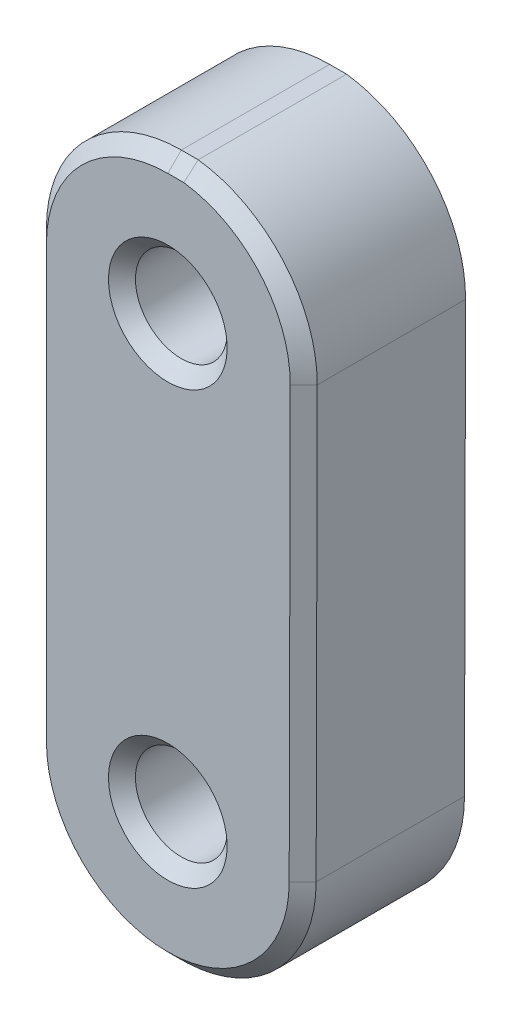
ISO-10303-21;
HEADER;
FILE_DESCRIPTION(('STEP AP214'),'2;1');
FILE_NAME('part.step','',(''),(''),'','','');
FILE_SCHEMA(('AUTOMOTIVE_DESIGN { 1 0 10303 214 1 1 1 1 }'));
ENDSEC;
DATA;
#1=APPLICATION_CONTEXT('core data for automotive mechanical design processes');
#2=APPLICATION_PROTOCOL_DEFINITION('international standard','automotive_design',2000,#1);
#3=PRODUCT_CONTEXT('',#1,'mechanical');
#4=PRODUCT('Part','Part','',(#3));
#5=PRODUCT_RELATED_PRODUCT_CATEGORY('part','',(#4));
#6=PRODUCT_DEFINITION_FORMATION('','',#4);
#7=PRODUCT_DEFINITION_CONTEXT('part definition',#1,'design');
#8=PRODUCT_DEFINITION('design','',#6,#7);
#9=PRODUCT_DEFINITION_SHAPE('','',#8);
#10=(LENGTH_UNIT() NAMED_UNIT(*) SI_UNIT(.MILLI.,.METRE.));
#11=(NAMED_UNIT(*) PLANE_ANGLE_UNIT() SI_UNIT($,.RADIAN.));
#12=(NAMED_UNIT(*) SI_UNIT($,.STERADIAN.) SOLID_ANGLE_UNIT());
#13=UNCERTAINTY_MEASURE_WITH_UNIT(LENGTH_MEASURE(1.E-05),#10,'distance_accuracy_value','');
#14=(GEOMETRIC_REPRESENTATION_CONTEXT(3) GLOBAL_UNCERTAINTY_ASSIGNED_CONTEXT((#13)) GLOBAL_UNIT_ASSIGNED_CONTEXT((#10,
#11,#12)) REPRESENTATION_CONTEXT('',''));
#15=CARTESIAN_POINT('',(0.,0.,0.));
#16=DIRECTION('',(0.,0.,1.));
#17=DIRECTION('',(1.,0.,0.));
#18=AXIS2_PLACEMENT_3D('',#15,#16,#17);
#19=CARTESIAN_POINT('',(-19.,-8.,6.));
#20=DIRECTION('',(0.,0.,-1.));
#21=DIRECTION('',(-1.,0.,0.));
#22=AXIS2_PLACEMENT_3D('',#19,#20,#21);
#23=CYLINDRICAL_SURFACE('',#22,1.70000000000001);
#24=CARTESIAN_POINT('',(-19.,-8.,5.49999999999999));
#25=DIRECTION('',(0.,0.,-1.));
#26=DIRECTION('',(-1.,0.,0.));
#27=AXIS2_PLACEMENT_3D('',#24,#25,#26);
#28=CIRCLE('',#27,1.70000000000001);
#29=CARTESIAN_POINT('',(-20.7,-8.,5.49999999999999));
#30=VERTEX_POINT('',#29);
#31=EDGE_CURVE('E11',#30,#30,#28,.F.);
#32=ORIENTED_EDGE('',*,*,#31,.T.);
#33=EDGE_LOOP('',(#32));
#34=FACE_BOUND('',#33,.T.);
#35=CARTESIAN_POINT('',(-19.,-8.,2.4));
#36=DIRECTION('',(0.,0.,-1.));
#37=DIRECTION('',(-1.,0.,0.));
#38=AXIS2_PLACEMENT_3D('',#35,#36,#37);
#39=CIRCLE('',#38,1.70000000000001);
#40=CARTESIAN_POINT('',(-20.7,-8.,2.4));
#41=VERTEX_POINT('',#40);
#42=EDGE_CURVE('E234',#41,#41,#39,.T.);
#43=ORIENTED_EDGE('',*,*,#42,.T.);
#44=EDGE_LOOP('',(#43));
#45=FACE_BOUND('',#44,.T.);
#46=ADVANCED_FACE('F36',(#34,#45),#23,.F.);
#47=CARTESIAN_POINT('',(-19.,8.,6.));
#48=DIRECTION('',(0.,0.,-1.));
#49=DIRECTION('',(-1.,0.,0.));
#50=AXIS2_PLACEMENT_3D('',#47,#48,#49);
#51=CYLINDRICAL_SURFACE('',#50,1.70000000000001);
#52=CARTESIAN_POINT('',(-19.,8.,5.49999999999999));
#53=DIRECTION('',(0.,0.,-1.));
#54=DIRECTION('',(-1.,0.,0.));
#55=AXIS2_PLACEMENT_3D('',#52,#53,#54);
#56=CIRCLE('',#55,1.70000000000001);
#57=CARTESIAN_POINT('',(-20.7,8.,5.49999999999999));
#58=VERTEX_POINT('',#57);
#59=EDGE_CURVE('E45',#58,#58,#56,.F.);
#60=ORIENTED_EDGE('',*,*,#59,.T.);
#61=EDGE_LOOP('',(#60));
#62=FACE_BOUND('',#61,.T.);
#63=CARTESIAN_POINT('',(-19.,8.,2.4));
#64=DIRECTION('',(0.,0.,-1.));
#65=DIRECTION('',(-1.,0.,0.));
#66=AXIS2_PLACEMENT_3D('',#63,#64,#65);
#67=CIRCLE('',#66,1.70000000000001);
#68=CARTESIAN_POINT('',(-20.7,8.,2.4));
#69=VERTEX_POINT('',#68);
#70=EDGE_CURVE('E280',#69,#69,#67,.T.);
#71=ORIENTED_EDGE('',*,*,#70,.T.);
#72=EDGE_LOOP('',(#71));
#73=FACE_BOUND('',#72,.T.);
#74=ADVANCED_FACE('F400',(#62,#73),#51,.F.);
#75=CARTESIAN_POINT('',(19.,-8.,6.));
#76=DIRECTION('',(0.,0.,-1.));
#77=DIRECTION('',(-1.,0.,0.));
#78=AXIS2_PLACEMENT_3D('',#75,#76,#77);
#79=PLANE('',#78);
#80=CARTESIAN_POINT('',(-19.,8.,6.));
#81=DIRECTION('',(0.,0.,-1.));
#82=DIRECTION('',(-1.,0.,0.));
#83=AXIS2_PLACEMENT_3D('',#80,#81,#82);
#84=CIRCLE('',#83,4.53913779806721);
#85=CARTESIAN_POINT('',(-14.4609180170143,7.97779365421222,6.));
#86=VERTEX_POINT('',#85);
#87=CARTESIAN_POINT('',(-18.4052126852036,12.5,6.));
#88=VERTEX_POINT('',#87);
#89=EDGE_CURVE('E338',#86,#88,#84,.F.);
#90=ORIENTED_EDGE('',*,*,#89,.T.);
#91=DIRECTION('',(-1.,0.,0.));
#92=VECTOR('',#91,1.);
#93=CARTESIAN_POINT('',(19.,12.5,6.));
#94=LINE('',#93,#92);
#95=CARTESIAN_POINT('',(-19.,12.5,6.));
#96=VERTEX_POINT('',#95);
#97=EDGE_CURVE('E340',#88,#96,#94,.T.);
#98=ORIENTED_EDGE('',*,*,#97,.T.);
#99=CARTESIAN_POINT('',(-19.,8.,6.));
#100=DIRECTION('',(0.,0.,-1.));
#101=DIRECTION('',(-1.,0.,0.));
#102=AXIS2_PLACEMENT_3D('',#99,#100,#101);
#103=CIRCLE('',#102,4.5);
#104=CARTESIAN_POINT('',(-23.5,8.,6.));
#105=VERTEX_POINT('',#104);
#106=EDGE_CURVE('E336',#96,#105,#103,.F.);
#107=ORIENTED_EDGE('',*,*,#106,.T.);
#108=DIRECTION('',(0.,-1.,0.));
#109=VECTOR('',#108,1.);
#110=CARTESIAN_POINT('',(-23.5,-8.,6.));
#111=LINE('',#110,#109);
#112=CARTESIAN_POINT('',(-23.5,-8.,6.));
#113=VERTEX_POINT('',#112);
#114=EDGE_CURVE('E334',#105,#113,#111,.T.);
#115=ORIENTED_EDGE('',*,*,#114,.T.);
#116=CARTESIAN_POINT('',(-19.,-8.,6.));
#117=DIRECTION('',(0.,0.,-1.));
#118=DIRECTION('',(-1.,0.,0.));
#119=AXIS2_PLACEMENT_3D('',#116,#117,#118);
#120=CIRCLE('',#119,4.5);
#121=CARTESIAN_POINT('',(-14.5000014958553,-7.99999999604275,6.));
#122=VERTEX_POINT('',#121);
#123=EDGE_CURVE('E332',#113,#122,#120,.F.);
#124=ORIENTED_EDGE('',*,*,#123,.T.);
#125=DIRECTION('',(0.00244610506116911,0.99999700828054,0.));
#126=VECTOR('',#125,1.);
#127=CARTESIAN_POINT('',(-14.499801050952,-7.91805572194682,6.));
#128=LINE('',#127,#126);
#129=EDGE_CURVE('E330',#122,#86,#128,.T.);
#130=ORIENTED_EDGE('',*,*,#129,.T.);
#131=EDGE_LOOP('',(#90,#98,#107,#115,#124,#130));
#132=FACE_BOUND('',#131,.T.);
#133=CARTESIAN_POINT('',(-19.,8.,6.));
#134=DIRECTION('',(0.,0.,-1.));
#135=DIRECTION('',(-1.,0.,0.));
#136=AXIS2_PLACEMENT_3D('',#133,#134,#135);
#137=CIRCLE('',#136,2.20000000000003);
#138=CARTESIAN_POINT('',(-21.2,8.,6.));
#139=VERTEX_POINT('',#138);
#140=EDGE_CURVE('E327',#139,#139,#137,.T.);
#141=ORIENTED_EDGE('',*,*,#140,.T.);
#142=EDGE_LOOP('',(#141));
#143=FACE_BOUND('',#142,.T.);
#144=CARTESIAN_POINT('',(-19.,-8.,6.));
#145=DIRECTION('',(0.,0.,-1.));
#146=DIRECTION('',(-1.,0.,0.));
#147=AXIS2_PLACEMENT_3D('',#144,#145,#146);
#148=CIRCLE('',#147,2.20000000000003);
#149=CARTESIAN_POINT('',(-21.2,-8.,6.));
#150=VERTEX_POINT('',#149);
#151=EDGE_CURVE('E320',#150,#150,#148,.T.);
#152=ORIENTED_EDGE('',*,*,#151,.T.);
#153=EDGE_LOOP('',(#152));
#154=FACE_BOUND('',#153,.T.);
#155=ADVANCED_FACE('F406',(#132,#143,#154),#79,.F.);
#156=CARTESIAN_POINT('',(19.,-8.,0.));
#157=DIRECTION('',(0.,0.,-1.));
#158=DIRECTION('',(-1.,0.,0.));
#159=AXIS2_PLACEMENT_3D('',#156,#157,#158);
#160=PLANE('',#159);
#161=DIRECTION('',(-1.,0.,0.));
#162=VECTOR('',#161,1.);
#163=CARTESIAN_POINT('',(-17.4,-10.7712812921102,0.));
#164=LINE('',#163,#162);
#165=CARTESIAN_POINT('',(-17.4,-10.7712812921102,0.));
#166=VERTEX_POINT('',#165);
#167=CARTESIAN_POINT('',(-20.6,-10.7712812921102,0.));
#168=VERTEX_POINT('',#167);
#169=EDGE_CURVE('E190',#166,#168,#164,.T.);
#170=ORIENTED_EDGE('',*,*,#169,.F.);
#171=DIRECTION('',(-0.500000000000001,-0.866025403784438,0.));
#172=VECTOR('',#171,1.);
#173=CARTESIAN_POINT('',(-15.8,-8.,0.));
#174=LINE('',#173,#172);
#175=CARTESIAN_POINT('',(-15.8,-8.,0.));
#176=VERTEX_POINT('',#175);
#177=EDGE_CURVE('E208',#176,#166,#174,.T.);
#178=ORIENTED_EDGE('',*,*,#177,.F.);
#179=DIRECTION('',(0.499999999999999,-0.866025403784439,0.));
#180=VECTOR('',#179,1.);
#181=CARTESIAN_POINT('',(-17.4,-5.2287187078898,0.));
#182=LINE('',#181,#180);
#183=CARTESIAN_POINT('',(-17.4,-5.2287187078898,0.));
#184=VERTEX_POINT('',#183);
#185=EDGE_CURVE('E211',#184,#176,#182,.T.);
#186=ORIENTED_EDGE('',*,*,#185,.F.);
#187=DIRECTION('',(1.,0.,0.));
#188=VECTOR('',#187,1.);
#189=CARTESIAN_POINT('',(-20.6,-5.2287187078898,0.));
#190=LINE('',#189,#188);
#191=CARTESIAN_POINT('',(-20.6,-5.2287187078898,0.));
#192=VERTEX_POINT('',#191);
#193=EDGE_CURVE('E227',#192,#184,#190,.T.);
#194=ORIENTED_EDGE('',*,*,#193,.F.);
#195=DIRECTION('',(0.5,0.866025403784439,0.));
#196=VECTOR('',#195,1.);
#197=CARTESIAN_POINT('',(-22.2,-8.,0.));
#198=LINE('',#197,#196);
#199=CARTESIAN_POINT('',(-22.2,-8.,0.));
#200=VERTEX_POINT('',#199);
#201=EDGE_CURVE('E224',#200,#192,#198,.T.);
#202=ORIENTED_EDGE('',*,*,#201,.F.);
#203=DIRECTION('',(-0.499999999999999,0.866025403784439,0.));
#204=VECTOR('',#203,1.);
#205=CARTESIAN_POINT('',(-20.6,-10.7712812921102,0.));
#206=LINE('',#205,#204);
#207=EDGE_CURVE('E222',#168,#200,#206,.T.);
#208=ORIENTED_EDGE('',*,*,#207,.F.);
#209=EDGE_LOOP('',(#170,#178,#186,#194,#202,#208));
#210=FACE_BOUND('',#209,.T.);
#211=DIRECTION('',(-1.,0.,0.));
#212=VECTOR('',#211,1.);
#213=CARTESIAN_POINT('',(-17.4,5.22871870788979,0.));
#214=LINE('',#213,#212);
#215=CARTESIAN_POINT('',(-17.4,5.22871870788979,0.));
#216=VERTEX_POINT('',#215);
#217=CARTESIAN_POINT('',(-20.6,5.22871870788979,0.));
#218=VERTEX_POINT('',#217);
#219=EDGE_CURVE('E262',#216,#218,#214,.T.);
#220=ORIENTED_EDGE('',*,*,#219,.F.);
#221=DIRECTION('',(-0.5,-0.866025403784438,0.));
#222=VECTOR('',#221,1.);
#223=CARTESIAN_POINT('',(-15.8,8.,0.));
#224=LINE('',#223,#222);
#225=CARTESIAN_POINT('',(-15.8,8.,0.));
#226=VERTEX_POINT('',#225);
#227=EDGE_CURVE('E246',#226,#216,#224,.T.);
#228=ORIENTED_EDGE('',*,*,#227,.F.);
#229=DIRECTION('',(0.500000000000001,-0.866025403784438,0.));
#230=VECTOR('',#229,1.);
#231=CARTESIAN_POINT('',(-17.4,10.7712812921102,0.));
#232=LINE('',#231,#230);
#233=CARTESIAN_POINT('',(-17.4,10.7712812921102,0.));
#234=VERTEX_POINT('',#233);
#235=EDGE_CURVE('E273',#234,#226,#232,.T.);
#236=ORIENTED_EDGE('',*,*,#235,.F.);
#237=DIRECTION('',(1.,0.,0.));
#238=VECTOR('',#237,1.);
#239=CARTESIAN_POINT('',(-20.6,10.7712812921102,0.));
#240=LINE('',#239,#238);
#241=CARTESIAN_POINT('',(-20.6,10.7712812921102,0.));
#242=VERTEX_POINT('',#241);
#243=EDGE_CURVE('E270',#242,#234,#240,.T.);
#244=ORIENTED_EDGE('',*,*,#243,.F.);
#245=DIRECTION('',(0.5,0.866025403784438,0.));
#246=VECTOR('',#245,1.);
#247=CARTESIAN_POINT('',(-22.2,7.99999999999999,0.));
#248=LINE('',#247,#246);
#249=CARTESIAN_POINT('',(-22.2,7.99999999999999,0.));
#250=VERTEX_POINT('',#249);
#251=EDGE_CURVE('E267',#250,#242,#248,.T.);
#252=ORIENTED_EDGE('',*,*,#251,.F.);
#253=DIRECTION('',(-0.5,0.866025403784439,0.));
#254=VECTOR('',#253,1.);
#255=CARTESIAN_POINT('',(-20.6,5.22871870788979,0.));
#256=LINE('',#255,#254);
#257=EDGE_CURVE('E264',#218,#250,#256,.T.);
#258=ORIENTED_EDGE('',*,*,#257,.F.);
#259=EDGE_LOOP('',(#220,#228,#236,#244,#252,#258));
#260=FACE_BOUND('',#259,.T.);
#261=DIRECTION('',(-0.00244610506116911,-0.99999700828054,0.));
#262=VECTOR('',#261,1.);
#263=CARTESIAN_POINT('',(-13.9803474500364,0.0341975009637657,0.));
#264=LINE('',#263,#262);
#265=CARTESIAN_POINT('',(-13.960922504589,7.97534755281011,0.));
#266=VERTEX_POINT('',#265);
#267=CARTESIAN_POINT('',(-14.,-7.99999999966864,0.));
#268=VERTEX_POINT('',#267);
#269=EDGE_CURVE('E293',#266,#268,#264,.T.);
#270=ORIENTED_EDGE('',*,*,#269,.T.);
#271=CARTESIAN_POINT('',(-19.,-8.,0.));
#272=DIRECTION('',(0.,0.,1.));
#273=DIRECTION('',(-1.,0.,0.));
#274=AXIS2_PLACEMENT_3D('',#271,#272,#273);
#275=CIRCLE('',#274,5.);
#276=CARTESIAN_POINT('',(-24.,-8.,0.));
#277=VERTEX_POINT('',#276);
#278=EDGE_CURVE('E312',#277,#268,#275,.T.);
#279=ORIENTED_EDGE('',*,*,#278,.F.);
#280=DIRECTION('',(0.,-1.,0.));
#281=VECTOR('',#280,1.);
#282=CARTESIAN_POINT('',(-24.,-8.,0.));
#283=LINE('',#282,#281);
#284=CARTESIAN_POINT('',(-24.,8.,0.));
#285=VERTEX_POINT('',#284);
#286=EDGE_CURVE('E309',#285,#277,#283,.T.);
#287=ORIENTED_EDGE('',*,*,#286,.F.);
#288=CARTESIAN_POINT('',(-19.,8.,0.));
#289=DIRECTION('',(0.,0.,1.));
#290=DIRECTION('',(-1.,0.,0.));
#291=AXIS2_PLACEMENT_3D('',#288,#289,#290);
#292=CIRCLE('',#291,5.);
#293=CARTESIAN_POINT('',(-19.,13.,0.));
#294=VERTEX_POINT('',#293);
#295=EDGE_CURVE('E306',#294,#285,#292,.T.);
#296=ORIENTED_EDGE('',*,*,#295,.F.);
#297=DIRECTION('',(-1.,0.,0.));
#298=VECTOR('',#297,1.);
#299=CARTESIAN_POINT('',(-19.,13.,0.));
#300=LINE('',#299,#298);
#301=CARTESIAN_POINT('',(-18.373174866562,13.,0.));
#302=VERTEX_POINT('',#301);
#303=EDGE_CURVE('E299',#302,#294,#300,.T.);
#304=ORIENTED_EDGE('',*,*,#303,.F.);
#305=CARTESIAN_POINT('',(-19.,8.,0.));
#306=DIRECTION('',(0.,0.,1.));
#307=DIRECTION('',(1.,0.,0.));
#308=AXIS2_PLACEMENT_3D('',#305,#306,#307);
#309=CIRCLE('',#308,5.03913779806721);
#310=EDGE_CURVE('E291',#266,#302,#309,.T.);
#311=ORIENTED_EDGE('',*,*,#310,.F.);
#312=EDGE_LOOP('',(#270,#279,#287,#296,#304,#311));
#313=FACE_BOUND('',#312,.T.);
#314=ADVANCED_FACE('F414',(#210,#260,#313),#160,.T.);
#315=CARTESIAN_POINT('',(-19.,13.,6.));
#316=DIRECTION('',(0.,-1.,0.));
#317=DIRECTION('',(0.,0.,-1.));
#318=AXIS2_PLACEMENT_3D('',#315,#316,#317);
#319=PLANE('',#318);
#320=DIRECTION('',(0.,0.,-1.));
#321=VECTOR('',#320,1.);
#322=CARTESIAN_POINT('',(-19.,13.,6.));
#323=LINE('',#322,#321);
#324=CARTESIAN_POINT('',(-19.,13.,5.5));
#325=VERTEX_POINT('',#324);
#326=EDGE_CURVE('E318',#325,#294,#323,.T.);
#327=ORIENTED_EDGE('',*,*,#326,.F.);
#328=DIRECTION('',(1.,0.,0.));
#329=VECTOR('',#328,1.);
#330=CARTESIAN_POINT('',(-19.,13.,5.5));
#331=LINE('',#330,#329);
#332=CARTESIAN_POINT('',(-18.373174866562,13.,5.5));
#333=VERTEX_POINT('',#332);
#334=EDGE_CURVE('E343',#325,#333,#331,.T.);
#335=ORIENTED_EDGE('',*,*,#334,.T.);
#336=DIRECTION('',(0.,0.,1.));
#337=VECTOR('',#336,1.);
#338=CARTESIAN_POINT('',(-18.373174866562,13.,0.));
#339=LINE('',#338,#337);
#340=EDGE_CURVE('E296',#302,#333,#339,.T.);
#341=ORIENTED_EDGE('',*,*,#340,.F.);
#342=ORIENTED_EDGE('',*,*,#303,.T.);
#343=EDGE_LOOP('',(#327,#335,#341,#342));
#344=FACE_BOUND('',#343,.T.);
#345=ADVANCED_FACE('F418',(#344),#319,.F.);
#346=CARTESIAN_POINT('',(-19.,8.,6.));
#347=DIRECTION('',(0.,0.,-1.));
#348=DIRECTION('',(-1.,0.,0.));
#349=AXIS2_PLACEMENT_3D('',#346,#347,#348);
#350=CYLINDRICAL_SURFACE('',#349,5.);
#351=DIRECTION('',(0.,0.,-1.));
#352=VECTOR('',#351,1.);
#353=CARTESIAN_POINT('',(-24.,8.,6.));
#354=LINE('',#353,#352);
#355=CARTESIAN_POINT('',(-24.,8.,5.5));
#356=VERTEX_POINT('',#355);
#357=EDGE_CURVE('E316',#356,#285,#354,.T.);
#358=ORIENTED_EDGE('',*,*,#357,.F.);
#359=CARTESIAN_POINT('',(-19.,8.,5.5));
#360=DIRECTION('',(0.,0.,-1.));
#361=DIRECTION('',(-1.,0.,0.));
#362=AXIS2_PLACEMENT_3D('',#359,#360,#361);
#363=CIRCLE('',#362,5.);
#364=EDGE_CURVE('E348',#356,#325,#363,.T.);
#365=ORIENTED_EDGE('',*,*,#364,.T.);
#366=ORIENTED_EDGE('',*,*,#326,.T.);
#367=ORIENTED_EDGE('',*,*,#295,.T.);
#368=EDGE_LOOP('',(#358,#365,#366,#367));
#369=FACE_BOUND('',#368,.T.);
#370=ADVANCED_FACE('F427',(#369),#350,.T.);
#371=CARTESIAN_POINT('',(-24.,-8.,6.));
#372=DIRECTION('',(1.,0.,0.));
#373=DIRECTION('',(0.,0.,-1.));
#374=AXIS2_PLACEMENT_3D('',#371,#372,#373);
#375=PLANE('',#374);
#376=DIRECTION('',(0.,0.,-1.));
#377=VECTOR('',#376,1.);
#378=CARTESIAN_POINT('',(-24.,-8.,6.));
#379=LINE('',#378,#377);
#380=CARTESIAN_POINT('',(-24.,-8.,5.5));
#381=VERTEX_POINT('',#380);
#382=EDGE_CURVE('E314',#381,#277,#379,.T.);
#383=ORIENTED_EDGE('',*,*,#382,.F.);
#384=DIRECTION('',(0.,1.,0.));
#385=VECTOR('',#384,1.);
#386=CARTESIAN_POINT('',(-24.,-8.,5.5));
#387=LINE('',#386,#385);
#388=EDGE_CURVE('E350',#381,#356,#387,.T.);
#389=ORIENTED_EDGE('',*,*,#388,.T.);
#390=ORIENTED_EDGE('',*,*,#357,.T.);
#391=ORIENTED_EDGE('',*,*,#286,.T.);
#392=EDGE_LOOP('',(#383,#389,#390,#391));
#393=FACE_BOUND('',#392,.T.);
#394=ADVANCED_FACE('F424',(#393),#375,.F.);
#395=CARTESIAN_POINT('',(-19.,-8.,6.));
#396=DIRECTION('',(0.,0.,-1.));
#397=DIRECTION('',(-1.,0.,0.));
#398=AXIS2_PLACEMENT_3D('',#395,#396,#397);
#399=CYLINDRICAL_SURFACE('',#398,5.);
#400=DIRECTION('',(0.,0.,1.));
#401=VECTOR('',#400,1.);
#402=CARTESIAN_POINT('',(-14.,-7.99999999966864,0.));
#403=LINE('',#402,#401);
#404=CARTESIAN_POINT('',(-14.,-7.99999999966864,5.5));
#405=VERTEX_POINT('',#404);
#406=EDGE_CURVE('E297',#268,#405,#403,.T.);
#407=ORIENTED_EDGE('',*,*,#406,.T.);
#408=CARTESIAN_POINT('',(-19.,-8.,5.5));
#409=DIRECTION('',(0.,0.,-1.));
#410=DIRECTION('',(-1.,0.,0.));
#411=AXIS2_PLACEMENT_3D('',#408,#409,#410);
#412=CIRCLE('',#411,5.);
#413=EDGE_CURVE('E60',#405,#381,#412,.T.);
#414=ORIENTED_EDGE('',*,*,#413,.T.);
#415=ORIENTED_EDGE('',*,*,#382,.T.);
#416=ORIENTED_EDGE('',*,*,#278,.T.);
#417=EDGE_LOOP('',(#407,#414,#415,#416));
#418=FACE_BOUND('',#417,.T.);
#419=ADVANCED_FACE('F420',(#418),#399,.T.);
#420=CARTESIAN_POINT('',(-19.,8.,0.));
#421=DIRECTION('',(0.,0.,1.));
#422=DIRECTION('',(1.,0.,0.));
#423=AXIS2_PLACEMENT_3D('',#420,#421,#422);
#424=CYLINDRICAL_SURFACE('',#423,5.03913779806721);
#425=ORIENTED_EDGE('',*,*,#340,.T.);
#426=CARTESIAN_POINT('',(-19.,8.,5.5));
#427=DIRECTION('',(0.,0.,-1.));
#428=DIRECTION('',(-1.,0.,0.));
#429=AXIS2_PLACEMENT_3D('',#426,#427,#428);
#430=CIRCLE('',#429,5.03913779806721);
#431=CARTESIAN_POINT('',(-13.960922504589,7.97534755281011,5.5));
#432=VERTEX_POINT('',#431);
#433=EDGE_CURVE('E346',#333,#432,#430,.T.);
#434=ORIENTED_EDGE('',*,*,#433,.T.);
#435=DIRECTION('',(0.,0.,1.));
#436=VECTOR('',#435,1.);
#437=CARTESIAN_POINT('',(-13.960922504589,7.97534755281011,0.));
#438=LINE('',#437,#436);
#439=EDGE_CURVE('E300',#266,#432,#438,.T.);
#440=ORIENTED_EDGE('',*,*,#439,.F.);
#441=ORIENTED_EDGE('',*,*,#310,.T.);
#442=EDGE_LOOP('',(#425,#434,#440,#441));
#443=FACE_BOUND('',#442,.T.);
#444=ADVANCED_FACE('F423',(#443),#424,.T.);
#445=CARTESIAN_POINT('',(-13.9803474500364,0.0341975009637657,0.));
#446=DIRECTION('',(-0.99999700828054,0.00244610506116911,0.));
#447=DIRECTION('',(-0.00244610506116911,-0.99999700828054,0.));
#448=AXIS2_PLACEMENT_3D('',#445,#446,#447);
#449=PLANE('',#448);
#450=ORIENTED_EDGE('',*,*,#439,.T.);
#451=DIRECTION('',(-0.00244610506116911,-0.99999700828054,0.));
#452=VECTOR('',#451,1.);
#453=CARTESIAN_POINT('',(-13.9803474500364,0.0341975009637657,5.5));
#454=LINE('',#453,#452);
#455=EDGE_CURVE('E53',#432,#405,#454,.T.);
#456=ORIENTED_EDGE('',*,*,#455,.T.);
#457=ORIENTED_EDGE('',*,*,#406,.F.);
#458=ORIENTED_EDGE('',*,*,#269,.F.);
#459=EDGE_LOOP('',(#450,#456,#457,#458));
#460=FACE_BOUND('',#459,.T.);
#461=ADVANCED_FACE('F458',(#460),#449,.F.);
#462=CARTESIAN_POINT('',(-17.4,5.22871870788979,2.4));
#463=DIRECTION('',(0.,-1.,0.));
#464=DIRECTION('',(1.,0.,0.));
#465=AXIS2_PLACEMENT_3D('',#462,#463,#464);
#466=PLANE('',#465);
#467=ORIENTED_EDGE('',*,*,#219,.T.);
#468=DIRECTION('',(0.,0.,-1.));
#469=VECTOR('',#468,1.);
#470=CARTESIAN_POINT('',(-20.6,5.22871870788979,2.4));
#471=LINE('',#470,#469);
#472=CARTESIAN_POINT('',(-20.6,5.22871870788979,2.4));
#473=VERTEX_POINT('',#472);
#474=EDGE_CURVE('E261',#473,#218,#471,.T.);
#475=ORIENTED_EDGE('',*,*,#474,.F.);
#476=DIRECTION('',(-1.,0.,0.));
#477=VECTOR('',#476,1.);
#478=CARTESIAN_POINT('',(-17.4,5.22871870788979,2.4));
#479=LINE('',#478,#477);
#480=CARTESIAN_POINT('',(-17.4,5.22871870788979,2.4));
#481=VERTEX_POINT('',#480);
#482=EDGE_CURVE('E242',#481,#473,#479,.T.);
#483=ORIENTED_EDGE('',*,*,#482,.F.);
#484=DIRECTION('',(0.,0.,-1.));
#485=VECTOR('',#484,1.);
#486=CARTESIAN_POINT('',(-17.4,5.22871870788979,2.4));
#487=LINE('',#486,#485);
#488=EDGE_CURVE('E278',#481,#216,#487,.T.);
#489=ORIENTED_EDGE('',*,*,#488,.T.);
#490=EDGE_LOOP('',(#467,#475,#483,#489));
#491=FACE_BOUND('',#490,.T.);
#492=ADVANCED_FACE('F472',(#491),#466,.F.);
#493=CARTESIAN_POINT('',(-15.8,8.,2.4));
#494=DIRECTION('',(0.866025403784438,-0.5,0.));
#495=DIRECTION('',(0.5,0.866025403784439,0.));
#496=AXIS2_PLACEMENT_3D('',#493,#494,#495);
#497=PLANE('',#496);
#498=ORIENTED_EDGE('',*,*,#227,.T.);
#499=ORIENTED_EDGE('',*,*,#488,.F.);
#500=DIRECTION('',(-0.5,-0.866025403784438,0.));
#501=VECTOR('',#500,1.);
#502=CARTESIAN_POINT('',(-15.8,8.,2.4));
#503=LINE('',#502,#501);
#504=CARTESIAN_POINT('',(-15.8,8.,2.4));
#505=VERTEX_POINT('',#504);
#506=EDGE_CURVE('E258',#505,#481,#503,.T.);
#507=ORIENTED_EDGE('',*,*,#506,.F.);
#508=DIRECTION('',(0.,0.,-1.));
#509=VECTOR('',#508,1.);
#510=CARTESIAN_POINT('',(-15.8,8.,2.4));
#511=LINE('',#510,#509);
#512=EDGE_CURVE('E281',#505,#226,#511,.T.);
#513=ORIENTED_EDGE('',*,*,#512,.T.);
#514=EDGE_LOOP('',(#498,#499,#507,#513));
#515=FACE_BOUND('',#514,.T.);
#516=ADVANCED_FACE('F478',(#515),#497,.F.);
#517=CARTESIAN_POINT('',(-17.4,10.7712812921102,2.4));
#518=DIRECTION('',(0.866025403784438,0.500000000000001,0.));
#519=DIRECTION('',(-0.500000000000001,0.866025403784438,0.));
#520=AXIS2_PLACEMENT_3D('',#517,#518,#519);
#521=PLANE('',#520);
#522=ORIENTED_EDGE('',*,*,#235,.T.);
#523=ORIENTED_EDGE('',*,*,#512,.F.);
#524=DIRECTION('',(0.500000000000001,-0.866025403784438,0.));
#525=VECTOR('',#524,1.);
#526=CARTESIAN_POINT('',(-17.4,10.7712812921102,2.4));
#527=LINE('',#526,#525);
#528=CARTESIAN_POINT('',(-17.4,10.7712812921102,2.4));
#529=VERTEX_POINT('',#528);
#530=EDGE_CURVE('E255',#529,#505,#527,.T.);
#531=ORIENTED_EDGE('',*,*,#530,.F.);
#532=DIRECTION('',(0.,0.,-1.));
#533=VECTOR('',#532,1.);
#534=CARTESIAN_POINT('',(-17.4,10.7712812921102,2.4));
#535=LINE('',#534,#533);
#536=EDGE_CURVE('E283',#529,#234,#535,.T.);
#537=ORIENTED_EDGE('',*,*,#536,.T.);
#538=EDGE_LOOP('',(#522,#523,#531,#537));
#539=FACE_BOUND('',#538,.T.);
#540=ADVANCED_FACE('F494',(#539),#521,.F.);
#541=CARTESIAN_POINT('',(-20.6,10.7712812921102,2.4));
#542=DIRECTION('',(0.,1.,0.));
#543=DIRECTION('',(0.,0.,1.));
#544=AXIS2_PLACEMENT_3D('',#541,#542,#543);
#545=PLANE('',#544);
#546=ORIENTED_EDGE('',*,*,#243,.T.);
#547=ORIENTED_EDGE('',*,*,#536,.F.);
#548=DIRECTION('',(1.,0.,0.));
#549=VECTOR('',#548,1.);
#550=CARTESIAN_POINT('',(-20.6,10.7712812921102,2.4));
#551=LINE('',#550,#549);
#552=CARTESIAN_POINT('',(-20.6,10.7712812921102,2.4));
#553=VERTEX_POINT('',#552);
#554=EDGE_CURVE('E252',#553,#529,#551,.T.);
#555=ORIENTED_EDGE('',*,*,#554,.F.);
#556=DIRECTION('',(0.,0.,-1.));
#557=VECTOR('',#556,1.);
#558=CARTESIAN_POINT('',(-20.6,10.7712812921102,2.4));
#559=LINE('',#558,#557);
#560=EDGE_CURVE('E285',#553,#242,#559,.T.);
#561=ORIENTED_EDGE('',*,*,#560,.T.);
#562=EDGE_LOOP('',(#546,#547,#555,#561));
#563=FACE_BOUND('',#562,.T.);
#564=ADVANCED_FACE('F490',(#563),#545,.F.);
#565=CARTESIAN_POINT('',(-22.2,7.99999999999999,2.4));
#566=DIRECTION('',(-0.866025403784438,0.5,0.));
#567=DIRECTION('',(-0.5,-0.866025403784439,0.));
#568=AXIS2_PLACEMENT_3D('',#565,#566,#567);
#569=PLANE('',#568);
#570=ORIENTED_EDGE('',*,*,#251,.T.);
#571=ORIENTED_EDGE('',*,*,#560,.F.);
#572=DIRECTION('',(0.5,0.866025403784438,0.));
#573=VECTOR('',#572,1.);
#574=CARTESIAN_POINT('',(-22.2,7.99999999999999,2.4));
#575=LINE('',#574,#573);
#576=CARTESIAN_POINT('',(-22.2,7.99999999999999,2.4));
#577=VERTEX_POINT('',#576);
#578=EDGE_CURVE('E249',#577,#553,#575,.T.);
#579=ORIENTED_EDGE('',*,*,#578,.F.);
#580=DIRECTION('',(0.,0.,-1.));
#581=VECTOR('',#580,1.);
#582=CARTESIAN_POINT('',(-22.2,7.99999999999999,2.4));
#583=LINE('',#582,#581);
#584=EDGE_CURVE('E287',#577,#250,#583,.T.);
#585=ORIENTED_EDGE('',*,*,#584,.T.);
#586=EDGE_LOOP('',(#570,#571,#579,#585));
#587=FACE_BOUND('',#586,.T.);
#588=ADVANCED_FACE('F486',(#587),#569,.F.);
#589=CARTESIAN_POINT('',(-20.6,5.22871870788979,2.4));
#590=DIRECTION('',(-0.866025403784439,-0.5,0.));
#591=DIRECTION('',(0.5,-0.866025403784439,0.));
#592=AXIS2_PLACEMENT_3D('',#589,#590,#591);
#593=PLANE('',#592);
#594=ORIENTED_EDGE('',*,*,#257,.T.);
#595=ORIENTED_EDGE('',*,*,#584,.F.);
#596=DIRECTION('',(-0.5,0.866025403784439,0.));
#597=VECTOR('',#596,1.);
#598=CARTESIAN_POINT('',(-20.6,5.22871870788979,2.4));
#599=LINE('',#598,#597);
#600=EDGE_CURVE('E245',#473,#577,#599,.T.);
#601=ORIENTED_EDGE('',*,*,#600,.F.);
#602=ORIENTED_EDGE('',*,*,#474,.T.);
#603=EDGE_LOOP('',(#594,#595,#601,#602));
#604=FACE_BOUND('',#603,.T.);
#605=ADVANCED_FACE('F482',(#604),#593,.F.);
#606=CARTESIAN_POINT('',(0.,0.,2.4));
#607=DIRECTION('',(0.,0.,-1.));
#608=DIRECTION('',(-1.,0.,0.));
#609=AXIS2_PLACEMENT_3D('',#606,#607,#608);
#610=PLANE('',#609);
#611=ORIENTED_EDGE('',*,*,#70,.F.);
#612=EDGE_LOOP('',(#611));
#613=FACE_BOUND('',#612,.T.);
#614=ORIENTED_EDGE('',*,*,#482,.T.);
#615=ORIENTED_EDGE('',*,*,#600,.T.);
#616=ORIENTED_EDGE('',*,*,#578,.T.);
#617=ORIENTED_EDGE('',*,*,#554,.T.);
#618=ORIENTED_EDGE('',*,*,#530,.T.);
#619=ORIENTED_EDGE('',*,*,#506,.T.);
#620=EDGE_LOOP('',(#614,#615,#616,#617,#618,#619));
#621=FACE_BOUND('',#620,.T.);
#622=ADVANCED_FACE('F485',(#613,#621),#610,.T.);
#623=CARTESIAN_POINT('',(-17.4,-10.7712812921102,2.4));
#624=DIRECTION('',(0.,-1.,0.));
#625=DIRECTION('',(0.,0.,-1.));
#626=AXIS2_PLACEMENT_3D('',#623,#624,#625);
#627=PLANE('',#626);
#628=ORIENTED_EDGE('',*,*,#169,.T.);
#629=DIRECTION('',(0.,0.,-1.));
#630=VECTOR('',#629,1.);
#631=CARTESIAN_POINT('',(-20.6,-10.7712812921102,2.4));
#632=LINE('',#631,#630);
#633=CARTESIAN_POINT('',(-20.6,-10.7712812921102,2.4));
#634=VERTEX_POINT('',#633);
#635=EDGE_CURVE('E183',#634,#168,#632,.T.);
#636=ORIENTED_EDGE('',*,*,#635,.F.);
#637=DIRECTION('',(-1.,0.,0.));
#638=VECTOR('',#637,1.);
#639=CARTESIAN_POINT('',(-17.4,-10.7712812921102,2.4));
#640=LINE('',#639,#638);
#641=CARTESIAN_POINT('',(-17.4,-10.7712812921102,2.4));
#642=VERTEX_POINT('',#641);
#643=EDGE_CURVE('E187',#642,#634,#640,.T.);
#644=ORIENTED_EDGE('',*,*,#643,.F.);
#645=DIRECTION('',(0.,0.,-1.));
#646=VECTOR('',#645,1.);
#647=CARTESIAN_POINT('',(-17.4,-10.7712812921102,2.4));
#648=LINE('',#647,#646);
#649=EDGE_CURVE('E232',#642,#166,#648,.T.);
#650=ORIENTED_EDGE('',*,*,#649,.T.);
#651=EDGE_LOOP('',(#628,#636,#644,#650));
#652=FACE_BOUND('',#651,.T.);
#653=ADVANCED_FACE('F185',(#652),#627,.F.);
#654=CARTESIAN_POINT('',(-15.8,-8.,2.4));
#655=DIRECTION('',(0.866025403784438,-0.500000000000001,0.));
#656=DIRECTION('',(0.500000000000001,0.866025403784438,0.));
#657=AXIS2_PLACEMENT_3D('',#654,#655,#656);
#658=PLANE('',#657);
#659=ORIENTED_EDGE('',*,*,#177,.T.);
#660=ORIENTED_EDGE('',*,*,#649,.F.);
#661=DIRECTION('',(-0.500000000000001,-0.866025403784438,0.));
#662=VECTOR('',#661,1.);
#663=CARTESIAN_POINT('',(-15.8,-8.,2.4));
#664=LINE('',#663,#662);
#665=CARTESIAN_POINT('',(-15.8,-8.,2.4));
#666=VERTEX_POINT('',#665);
#667=EDGE_CURVE('E195',#666,#642,#664,.T.);
#668=ORIENTED_EDGE('',*,*,#667,.F.);
#669=DIRECTION('',(0.,0.,-1.));
#670=VECTOR('',#669,1.);
#671=CARTESIAN_POINT('',(-15.8,-8.,2.4));
#672=LINE('',#671,#670);
#673=EDGE_CURVE('E235',#666,#176,#672,.T.);
#674=ORIENTED_EDGE('',*,*,#673,.T.);
#675=EDGE_LOOP('',(#659,#660,#668,#674));
#676=FACE_BOUND('',#675,.T.);
#677=ADVANCED_FACE('F507',(#676),#658,.F.);
#678=CARTESIAN_POINT('',(-17.4,-5.2287187078898,2.4));
#679=DIRECTION('',(0.866025403784439,0.5,0.));
#680=DIRECTION('',(-0.5,0.866025403784439,0.));
#681=AXIS2_PLACEMENT_3D('',#678,#679,#680);
#682=PLANE('',#681);
#683=ORIENTED_EDGE('',*,*,#185,.T.);
#684=ORIENTED_EDGE('',*,*,#673,.F.);
#685=DIRECTION('',(0.499999999999999,-0.866025403784439,0.));
#686=VECTOR('',#685,1.);
#687=CARTESIAN_POINT('',(-17.4,-5.2287187078898,2.4));
#688=LINE('',#687,#686);
#689=CARTESIAN_POINT('',(-17.4,-5.2287187078898,2.4));
#690=VERTEX_POINT('',#689);
#691=EDGE_CURVE('E218',#690,#666,#688,.T.);
#692=ORIENTED_EDGE('',*,*,#691,.F.);
#693=DIRECTION('',(0.,0.,-1.));
#694=VECTOR('',#693,1.);
#695=CARTESIAN_POINT('',(-17.4,-5.2287187078898,2.4));
#696=LINE('',#695,#694);
#697=EDGE_CURVE('E237',#690,#184,#696,.T.);
#698=ORIENTED_EDGE('',*,*,#697,.T.);
#699=EDGE_LOOP('',(#683,#684,#692,#698));
#700=FACE_BOUND('',#699,.T.);
#701=ADVANCED_FACE('F517',(#700),#682,.F.);
#702=CARTESIAN_POINT('',(-20.6,-5.2287187078898,2.4));
#703=DIRECTION('',(0.,1.,0.));
#704=DIRECTION('',(-1.,0.,0.));
#705=AXIS2_PLACEMENT_3D('',#702,#703,#704);
#706=PLANE('',#705);
#707=ORIENTED_EDGE('',*,*,#193,.T.);
#708=ORIENTED_EDGE('',*,*,#697,.F.);
#709=DIRECTION('',(1.,0.,0.));
#710=VECTOR('',#709,1.);
#711=CARTESIAN_POINT('',(-20.6,-5.2287187078898,2.4));
#712=LINE('',#711,#710);
#713=CARTESIAN_POINT('',(-20.6,-5.2287187078898,2.4));
#714=VERTEX_POINT('',#713);
#715=EDGE_CURVE('E215',#714,#690,#712,.T.);
#716=ORIENTED_EDGE('',*,*,#715,.F.);
#717=DIRECTION('',(0.,0.,-1.));
#718=VECTOR('',#717,1.);
#719=CARTESIAN_POINT('',(-20.6,-5.2287187078898,2.4));
#720=LINE('',#719,#718);
#721=EDGE_CURVE('E239',#714,#192,#720,.T.);
#722=ORIENTED_EDGE('',*,*,#721,.T.);
#723=EDGE_LOOP('',(#707,#708,#716,#722));
#724=FACE_BOUND('',#723,.T.);
#725=ADVANCED_FACE('F513',(#724),#706,.F.);
#726=CARTESIAN_POINT('',(-22.2,-8.,2.4));
#727=DIRECTION('',(-0.866025403784439,0.5,0.));
#728=DIRECTION('',(-0.5,-0.866025403784439,0.));
#729=AXIS2_PLACEMENT_3D('',#726,#727,#728);
#730=PLANE('',#729);
#731=ORIENTED_EDGE('',*,*,#201,.T.);
#732=ORIENTED_EDGE('',*,*,#721,.F.);
#733=DIRECTION('',(0.5,0.866025403784439,0.));
#734=VECTOR('',#733,1.);
#735=CARTESIAN_POINT('',(-22.2,-8.,2.4));
#736=LINE('',#735,#734);
#737=CARTESIAN_POINT('',(-22.2,-8.,2.4));
#738=VERTEX_POINT('',#737);
#739=EDGE_CURVE('E203',#738,#714,#736,.T.);
#740=ORIENTED_EDGE('',*,*,#739,.F.);
#741=DIRECTION('',(0.,0.,-1.));
#742=VECTOR('',#741,1.);
#743=CARTESIAN_POINT('',(-22.2,-8.,2.4));
#744=LINE('',#743,#742);
#745=EDGE_CURVE('E194',#738,#200,#744,.T.);
#746=ORIENTED_EDGE('',*,*,#745,.T.);
#747=EDGE_LOOP('',(#731,#732,#740,#746));
#748=FACE_BOUND('',#747,.T.);
#749=ADVANCED_FACE('F510',(#748),#730,.F.);
#750=CARTESIAN_POINT('',(-20.6,-10.7712812921102,2.4));
#751=DIRECTION('',(-0.866025403784439,-0.499999999999999,0.));
#752=DIRECTION('',(0.499999999999999,-0.866025403784439,0.));
#753=AXIS2_PLACEMENT_3D('',#750,#751,#752);
#754=PLANE('',#753);
#755=ORIENTED_EDGE('',*,*,#207,.T.);
#756=ORIENTED_EDGE('',*,*,#745,.F.);
#757=DIRECTION('',(-0.499999999999999,0.866025403784439,0.));
#758=VECTOR('',#757,1.);
#759=CARTESIAN_POINT('',(-20.6,-10.7712812921102,2.4));
#760=LINE('',#759,#758);
#761=EDGE_CURVE('E198',#634,#738,#760,.T.);
#762=ORIENTED_EDGE('',*,*,#761,.F.);
#763=ORIENTED_EDGE('',*,*,#635,.T.);
#764=EDGE_LOOP('',(#755,#756,#762,#763));
#765=FACE_BOUND('',#764,.T.);
#766=ADVANCED_FACE('F199',(#765),#754,.F.);
#767=CARTESIAN_POINT('',(0.,0.,2.4));
#768=DIRECTION('',(0.,0.,-1.));
#769=DIRECTION('',(-1.,0.,0.));
#770=AXIS2_PLACEMENT_3D('',#767,#768,#769);
#771=PLANE('',#770);
#772=ORIENTED_EDGE('',*,*,#42,.F.);
#773=EDGE_LOOP('',(#772));
#774=FACE_BOUND('',#773,.T.);
#775=ORIENTED_EDGE('',*,*,#643,.T.);
#776=ORIENTED_EDGE('',*,*,#761,.T.);
#777=ORIENTED_EDGE('',*,*,#739,.T.);
#778=ORIENTED_EDGE('',*,*,#715,.T.);
#779=ORIENTED_EDGE('',*,*,#691,.T.);
#780=ORIENTED_EDGE('',*,*,#667,.T.);
#781=EDGE_LOOP('',(#775,#776,#777,#778,#779,#780));
#782=FACE_BOUND('',#781,.T.);
#783=ADVANCED_FACE('F205',(#774,#782),#771,.T.);
#784=CARTESIAN_POINT('',(-19.,-8.,6.));
#785=DIRECTION('',(0.,0.,-1.));
#786=DIRECTION('',(-1.,0.,0.));
#787=AXIS2_PLACEMENT_3D('',#784,#785,#786);
#788=CONICAL_SURFACE('',#787,4.5,0.785398163397448);
#789=DIRECTION('',(0.707106781186547,0.,0.707106781186547));
#790=VECTOR('',#789,1.);
#791=CARTESIAN_POINT('',(-24.,-8.,5.5));
#792=LINE('',#791,#790);
#793=EDGE_CURVE('E463',#381,#113,#792,.T.);
#794=ORIENTED_EDGE('',*,*,#793,.F.);
#795=ORIENTED_EDGE('',*,*,#413,.F.);
#796=DIRECTION('',(0.707106781186547,4.68599000833106E-11,-0.707106781186547));
#797=VECTOR('',#796,1.);
#798=CARTESIAN_POINT('',(-14.5,-7.99999999970178,6.));
#799=LINE('',#798,#797);
#800=EDGE_CURVE('E40',#122,#405,#799,.T.);
#801=ORIENTED_EDGE('',*,*,#800,.F.);
#802=ORIENTED_EDGE('',*,*,#123,.F.);
#803=EDGE_LOOP('',(#794,#795,#801,#802));
#804=FACE_BOUND('',#803,.T.);
#805=ADVANCED_FACE('F387',(#804),#788,.T.);
#806=CARTESIAN_POINT('',(-13.9803474500364,0.0341975009637657,5.5));
#807=DIRECTION('',(-0.707104665721437,0.00172965747624743,-0.70710678118654));
#808=DIRECTION('',(-0.00244610506116911,-0.99999700828054,0.));
#809=AXIS2_PLACEMENT_3D('',#806,#807,#808);
#810=PLANE('',#809);
#811=ORIENTED_EDGE('',*,*,#800,.T.);
#812=ORIENTED_EDGE('',*,*,#455,.F.);
#813=DIRECTION('',(0.707099377078405,-0.00345930460318643,-0.707105723457952));
#814=VECTOR('',#813,1.);
#815=CARTESIAN_POINT('',(-14.4609180170143,7.97779365421222,6.));
#816=LINE('',#815,#814);
#817=EDGE_CURVE('E455',#86,#432,#816,.T.);
#818=ORIENTED_EDGE('',*,*,#817,.F.);
#819=ORIENTED_EDGE('',*,*,#129,.F.);
#820=EDGE_LOOP('',(#811,#812,#818,#819));
#821=FACE_BOUND('',#820,.T.);
#822=ADVANCED_FACE('F383',(#821),#810,.F.);
#823=CARTESIAN_POINT('',(-23.5,-8.,6.));
#824=DIRECTION('',(0.70710678118655,0.,-0.707106781186545));
#825=DIRECTION('',(0.,-1.,0.));
#826=AXIS2_PLACEMENT_3D('',#823,#824,#825);
#827=PLANE('',#826);
#828=ORIENTED_EDGE('',*,*,#793,.T.);
#829=ORIENTED_EDGE('',*,*,#114,.F.);
#830=DIRECTION('',(0.707106781186545,0.,0.70710678118655));
#831=VECTOR('',#830,1.);
#832=CARTESIAN_POINT('',(-24.,8.,5.5));
#833=LINE('',#832,#831);
#834=EDGE_CURVE('E365',#356,#105,#833,.T.);
#835=ORIENTED_EDGE('',*,*,#834,.F.);
#836=ORIENTED_EDGE('',*,*,#388,.F.);
#837=EDGE_LOOP('',(#828,#829,#835,#836));
#838=FACE_BOUND('',#837,.T.);
#839=ADVANCED_FACE('F380',(#838),#827,.F.);
#840=CARTESIAN_POINT('',(-19.,8.,6.));
#841=DIRECTION('',(0.,0.,-1.));
#842=DIRECTION('',(-1.,0.,0.));
#843=AXIS2_PLACEMENT_3D('',#840,#841,#842);
#844=CONICAL_SURFACE('',#843,4.53913779806721,0.785398163397447);
#845=ORIENTED_EDGE('',*,*,#817,.T.);
#846=ORIENTED_EDGE('',*,*,#433,.F.);
#847=CARTESIAN_POINT('',(-18.373174866562,13.,5.5));
#848=CARTESIAN_POINT('',(-18.378374777237,12.9166621916902,5.58333780830981));
#849=CARTESIAN_POINT('',(-18.3836445507443,12.8333266216331,5.66667337836687));
#850=CARTESIAN_POINT('',(-18.3943238236197,12.6666599549663,5.8333400450337));
#851=CARTESIAN_POINT('',(-18.3997333229929,12.5833288583567,5.91667114164331));
#852=CARTESIAN_POINT('',(-18.4052126852036,12.5,6.));
#853=B_SPLINE_CURVE_WITH_KNOTS('',3,(#847,#848,#849,#850,#851,#852),.UNSPECIFIED.,.F.,.F.,(4,2,
4),(0.,0.353916155150612,0.70783232328948),.UNSPECIFIED.);
#854=EDGE_CURVE('E358',#88,#333,#853,.F.);
#855=ORIENTED_EDGE('',*,*,#854,.F.);
#856=ORIENTED_EDGE('',*,*,#89,.F.);
#857=EDGE_LOOP('',(#845,#846,#855,#856));
#858=FACE_BOUND('',#857,.T.);
#859=ADVANCED_FACE('F367',(#858),#844,.T.);
#860=CARTESIAN_POINT('',(-19.,8.,6.));
#861=DIRECTION('',(0.,0.,-1.));
#862=DIRECTION('',(-1.,0.,0.));
#863=AXIS2_PLACEMENT_3D('',#860,#861,#862);
#864=CONICAL_SURFACE('',#863,4.5,0.785398163397448);
#865=ORIENTED_EDGE('',*,*,#834,.T.);
#866=ORIENTED_EDGE('',*,*,#106,.F.);
#867=DIRECTION('',(0.,-0.707106781186547,0.707106781186547));
#868=VECTOR('',#867,1.);
#869=CARTESIAN_POINT('',(-19.,13.,5.5));
#870=LINE('',#869,#868);
#871=EDGE_CURVE('E356',#325,#96,#870,.T.);
#872=ORIENTED_EDGE('',*,*,#871,.F.);
#873=ORIENTED_EDGE('',*,*,#364,.F.);
#874=EDGE_LOOP('',(#865,#866,#872,#873));
#875=FACE_BOUND('',#874,.T.);
#876=ADVANCED_FACE('F375',(#875),#864,.T.);
#877=CARTESIAN_POINT('',(19.,12.5,6.));
#878=DIRECTION('',(0.,-0.70710678118655,-0.707106781186545));
#879=DIRECTION('',(-1.,0.,0.));
#880=AXIS2_PLACEMENT_3D('',#877,#878,#879);
#881=PLANE('',#880);
#882=ORIENTED_EDGE('',*,*,#854,.T.);
#883=ORIENTED_EDGE('',*,*,#334,.F.);
#884=ORIENTED_EDGE('',*,*,#871,.T.);
#885=ORIENTED_EDGE('',*,*,#97,.F.);
#886=EDGE_LOOP('',(#882,#883,#884,#885));
#887=FACE_BOUND('',#886,.T.);
#888=ADVANCED_FACE('F370',(#887),#881,.F.);
#889=CARTESIAN_POINT('',(-19.,8.,5.49999999999999));
#890=DIRECTION('',(0.,0.,1.));
#891=DIRECTION('',(1.,0.,0.));
#892=AXIS2_PLACEMENT_3D('',#889,#890,#891);
#893=CONICAL_SURFACE('',#892,1.70000000000001,0.78539816339745);
#894=ORIENTED_EDGE('',*,*,#140,.F.);
#895=EDGE_LOOP('',(#894));
#896=FACE_BOUND('',#895,.T.);
#897=ORIENTED_EDGE('',*,*,#59,.F.);
#898=EDGE_LOOP('',(#897));
#899=FACE_BOUND('',#898,.T.);
#900=ADVANCED_FACE('F374',(#896,#899),#893,.F.);
#901=CARTESIAN_POINT('',(-19.,-8.,5.49999999999999));
#902=DIRECTION('',(0.,0.,1.));
#903=DIRECTION('',(1.,0.,0.));
#904=AXIS2_PLACEMENT_3D('',#901,#902,#903);
#905=CONICAL_SURFACE('',#904,1.70000000000001,0.785398163397449);
#906=ORIENTED_EDGE('',*,*,#151,.F.);
#907=EDGE_LOOP('',(#906));
#908=FACE_BOUND('',#907,.T.);
#909=ORIENTED_EDGE('',*,*,#31,.F.);
#910=EDGE_LOOP('',(#909));
#911=FACE_BOUND('',#910,.T.);
#912=ADVANCED_FACE('F38',(#908,#911),#905,.F.);
#913=CLOSED_SHELL('',(#46,#74,#155,#314,#345,#370,#394,#419,#444,#461,#492,#516,#540,#564,#588,
#605,#622,#653,#677,#701,#725,#749,#766,#783,#805,#822,#839,#859,#876,#888,#900,#912));
#914=MANIFOLD_SOLID_BREP('B2',#913);
#915=ADVANCED_BREP_SHAPE_REPRESENTATION('',(#18,#914),#14);
#916=SHAPE_DEFINITION_REPRESENTATION(#9,#915);
ENDSEC;
END-ISO-10303-21;
